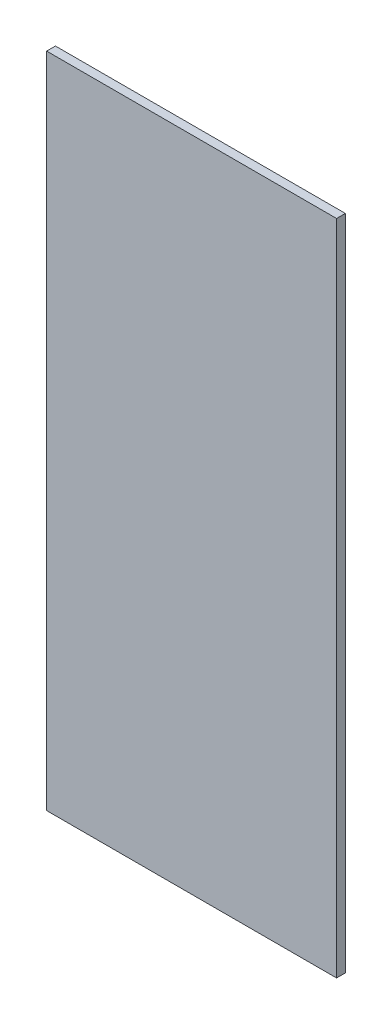
ISO-10303-21;
HEADER;
FILE_DESCRIPTION(('STEP AP214'),'2;1');
FILE_NAME('part.step','',(''),(''),'','','');
FILE_SCHEMA(('AUTOMOTIVE_DESIGN { 1 0 10303 214 1 1 1 1 }'));
ENDSEC;
DATA;
#1=APPLICATION_CONTEXT('core data for automotive mechanical design processes');
#2=APPLICATION_PROTOCOL_DEFINITION('international standard','automotive_design',2000,#1);
#3=PRODUCT_CONTEXT('',#1,'mechanical');
#4=PRODUCT('Part','Part','',(#3));
#5=PRODUCT_RELATED_PRODUCT_CATEGORY('part','',(#4));
#6=PRODUCT_DEFINITION_FORMATION('','',#4);
#7=PRODUCT_DEFINITION_CONTEXT('part definition',#1,'design');
#8=PRODUCT_DEFINITION('design','',#6,#7);
#9=PRODUCT_DEFINITION_SHAPE('','',#8);
#10=(LENGTH_UNIT() NAMED_UNIT(*) SI_UNIT(.MILLI.,.METRE.));
#11=(NAMED_UNIT(*) PLANE_ANGLE_UNIT() SI_UNIT($,.RADIAN.));
#12=(NAMED_UNIT(*) SI_UNIT($,.STERADIAN.) SOLID_ANGLE_UNIT());
#13=UNCERTAINTY_MEASURE_WITH_UNIT(LENGTH_MEASURE(1.E-05),#10,'distance_accuracy_value','');
#14=(GEOMETRIC_REPRESENTATION_CONTEXT(3) GLOBAL_UNCERTAINTY_ASSIGNED_CONTEXT((#13)) GLOBAL_UNIT_ASSIGNED_CONTEXT((#10,
#11,#12)) REPRESENTATION_CONTEXT('',''));
#15=CARTESIAN_POINT('',(0.,0.,0.));
#16=DIRECTION('',(0.,0.,1.));
#17=DIRECTION('',(1.,0.,0.));
#18=AXIS2_PLACEMENT_3D('',#15,#16,#17);
#19=CARTESIAN_POINT('',(1010.,-365.694880653011,5.));
#20=DIRECTION('',(-1.,0.,0.));
#21=DIRECTION('',(0.,0.,1.));
#22=AXIS2_PLACEMENT_3D('',#19,#20,#21);
#23=PLANE('',#22);
#24=DIRECTION('',(0.,1.,0.));
#25=VECTOR('',#24,1.);
#26=CARTESIAN_POINT('',(1010.,-365.694880653011,-5.));
#27=LINE('',#26,#25);
#28=CARTESIAN_POINT('',(1010.,-1114.30511934699,-5.));
#29=VERTEX_POINT('',#28);
#30=CARTESIAN_POINT('',(1010.,-365.694880653011,-5.));
#31=VERTEX_POINT('',#30);
#32=EDGE_CURVE('E102',#29,#31,#27,.T.);
#33=ORIENTED_EDGE('',*,*,#32,.T.);
#34=DIRECTION('',(0.,0.,-1.));
#35=VECTOR('',#34,1.);
#36=CARTESIAN_POINT('',(1010.,-365.694880653011,5.));
#37=LINE('',#36,#35);
#38=CARTESIAN_POINT('',(1010.,-365.694880653011,5.));
#39=VERTEX_POINT('',#38);
#40=EDGE_CURVE('E11',#39,#31,#37,.T.);
#41=ORIENTED_EDGE('',*,*,#40,.F.);
#42=DIRECTION('',(0.,1.,0.));
#43=VECTOR('',#42,1.);
#44=CARTESIAN_POINT('',(1010.,-365.694880653011,5.));
#45=LINE('',#44,#43);
#46=CARTESIAN_POINT('',(1010.,-1114.30511934699,5.));
#47=VERTEX_POINT('',#46);
#48=EDGE_CURVE('E90',#47,#39,#45,.T.);
#49=ORIENTED_EDGE('',*,*,#48,.F.);
#50=DIRECTION('',(0.,0.,-1.));
#51=VECTOR('',#50,1.);
#52=CARTESIAN_POINT('',(1010.,-1114.30511934699,5.));
#53=LINE('',#52,#51);
#54=EDGE_CURVE('E98',#47,#29,#53,.T.);
#55=ORIENTED_EDGE('',*,*,#54,.T.);
#56=EDGE_LOOP('',(#33,#41,#49,#55));
#57=FACE_BOUND('',#56,.T.);
#58=ADVANCED_FACE('F39',(#57),#23,.F.);
#59=CARTESIAN_POINT('',(1010.,-365.694880653011,5.));
#60=DIRECTION('',(0.,-1.,0.));
#61=DIRECTION('',(0.,0.,-1.));
#62=AXIS2_PLACEMENT_3D('',#59,#60,#61);
#63=PLANE('',#62);
#64=DIRECTION('',(-1.,0.,0.));
#65=VECTOR('',#64,1.);
#66=CARTESIAN_POINT('',(1010.,-365.694880653011,-5.));
#67=LINE('',#66,#65);
#68=CARTESIAN_POINT('',(680.,-365.694880653011,-5.));
#69=VERTEX_POINT('',#68);
#70=EDGE_CURVE('E94',#31,#69,#67,.T.);
#71=ORIENTED_EDGE('',*,*,#70,.T.);
#72=DIRECTION('',(0.,0.,-1.));
#73=VECTOR('',#72,1.);
#74=CARTESIAN_POINT('',(680.,-365.694880653011,5.));
#75=LINE('',#74,#73);
#76=CARTESIAN_POINT('',(680.,-365.694880653011,5.));
#77=VERTEX_POINT('',#76);
#78=EDGE_CURVE('E47',#77,#69,#75,.T.);
#79=ORIENTED_EDGE('',*,*,#78,.F.);
#80=DIRECTION('',(-1.,0.,0.));
#81=VECTOR('',#80,1.);
#82=CARTESIAN_POINT('',(1010.,-365.694880653011,5.));
#83=LINE('',#82,#81);
#84=EDGE_CURVE('E85',#39,#77,#83,.T.);
#85=ORIENTED_EDGE('',*,*,#84,.F.);
#86=ORIENTED_EDGE('',*,*,#40,.T.);
#87=EDGE_LOOP('',(#71,#79,#85,#86));
#88=FACE_BOUND('',#87,.T.);
#89=ADVANCED_FACE('F93',(#88),#63,.F.);
#90=CARTESIAN_POINT('',(680.,-365.694880653011,5.));
#91=DIRECTION('',(1.,0.,0.));
#92=DIRECTION('',(0.,0.,-1.));
#93=AXIS2_PLACEMENT_3D('',#90,#91,#92);
#94=PLANE('',#93);
#95=DIRECTION('',(0.,-1.,0.));
#96=VECTOR('',#95,1.);
#97=CARTESIAN_POINT('',(680.,-365.694880653011,-5.));
#98=LINE('',#97,#96);
#99=CARTESIAN_POINT('',(680.,-1114.30511934699,-5.));
#100=VERTEX_POINT('',#99);
#101=EDGE_CURVE('E72',#69,#100,#98,.T.);
#102=ORIENTED_EDGE('',*,*,#101,.T.);
#103=DIRECTION('',(0.,0.,-1.));
#104=VECTOR('',#103,1.);
#105=CARTESIAN_POINT('',(680.,-1114.30511934699,5.));
#106=LINE('',#105,#104);
#107=CARTESIAN_POINT('',(680.,-1114.30511934699,5.));
#108=VERTEX_POINT('',#107);
#109=EDGE_CURVE('E95',#108,#100,#106,.T.);
#110=ORIENTED_EDGE('',*,*,#109,.F.);
#111=DIRECTION('',(0.,-1.,0.));
#112=VECTOR('',#111,1.);
#113=CARTESIAN_POINT('',(680.,-365.694880653011,5.));
#114=LINE('',#113,#112);
#115=EDGE_CURVE('E88',#77,#108,#114,.T.);
#116=ORIENTED_EDGE('',*,*,#115,.F.);
#117=ORIENTED_EDGE('',*,*,#78,.T.);
#118=EDGE_LOOP('',(#102,#110,#116,#117));
#119=FACE_BOUND('',#118,.T.);
#120=ADVANCED_FACE('F96',(#119),#94,.F.);
#121=CARTESIAN_POINT('',(1010.,-1114.30511934699,5.));
#122=DIRECTION('',(0.,1.,0.));
#123=DIRECTION('',(0.,0.,1.));
#124=AXIS2_PLACEMENT_3D('',#121,#122,#123);
#125=PLANE('',#124);
#126=DIRECTION('',(1.,0.,0.));
#127=VECTOR('',#126,1.);
#128=CARTESIAN_POINT('',(1010.,-1114.30511934699,-5.));
#129=LINE('',#128,#127);
#130=EDGE_CURVE('E78',#100,#29,#129,.T.);
#131=ORIENTED_EDGE('',*,*,#130,.T.);
#132=ORIENTED_EDGE('',*,*,#54,.F.);
#133=DIRECTION('',(1.,0.,0.));
#134=VECTOR('',#133,1.);
#135=CARTESIAN_POINT('',(1010.,-1114.30511934699,5.));
#136=LINE('',#135,#134);
#137=EDGE_CURVE('E55',#108,#47,#136,.T.);
#138=ORIENTED_EDGE('',*,*,#137,.F.);
#139=ORIENTED_EDGE('',*,*,#109,.T.);
#140=EDGE_LOOP('',(#131,#132,#138,#139));
#141=FACE_BOUND('',#140,.T.);
#142=ADVANCED_FACE('F109',(#141),#125,.F.);
#143=CARTESIAN_POINT('',(0.,0.,5.));
#144=DIRECTION('',(0.,0.,-1.));
#145=DIRECTION('',(-1.,0.,0.));
#146=AXIS2_PLACEMENT_3D('',#143,#144,#145);
#147=PLANE('',#146);
#148=ORIENTED_EDGE('',*,*,#48,.T.);
#149=ORIENTED_EDGE('',*,*,#84,.T.);
#150=ORIENTED_EDGE('',*,*,#115,.T.);
#151=ORIENTED_EDGE('',*,*,#137,.T.);
#152=EDGE_LOOP('',(#148,#149,#150,#151));
#153=FACE_BOUND('',#152,.T.);
#154=ADVANCED_FACE('F86',(#153),#147,.F.);
#155=CARTESIAN_POINT('',(0.,0.,-5.));
#156=DIRECTION('',(0.,0.,-1.));
#157=DIRECTION('',(-1.,0.,0.));
#158=AXIS2_PLACEMENT_3D('',#155,#156,#157);
#159=PLANE('',#158);
#160=ORIENTED_EDGE('',*,*,#32,.F.);
#161=ORIENTED_EDGE('',*,*,#130,.F.);
#162=ORIENTED_EDGE('',*,*,#101,.F.);
#163=ORIENTED_EDGE('',*,*,#70,.F.);
#164=EDGE_LOOP('',(#160,#161,#162,#163));
#165=FACE_BOUND('',#164,.T.);
#166=ADVANCED_FACE('F112',(#165),#159,.T.);
#167=CLOSED_SHELL('',(#58,#89,#120,#142,#154,#166));
#168=MANIFOLD_SOLID_BREP('B2',#167);
#169=ADVANCED_BREP_SHAPE_REPRESENTATION('',(#18,#168),#14);
#170=SHAPE_DEFINITION_REPRESENTATION(#9,#169);
ENDSEC;
END-ISO-10303-21;
